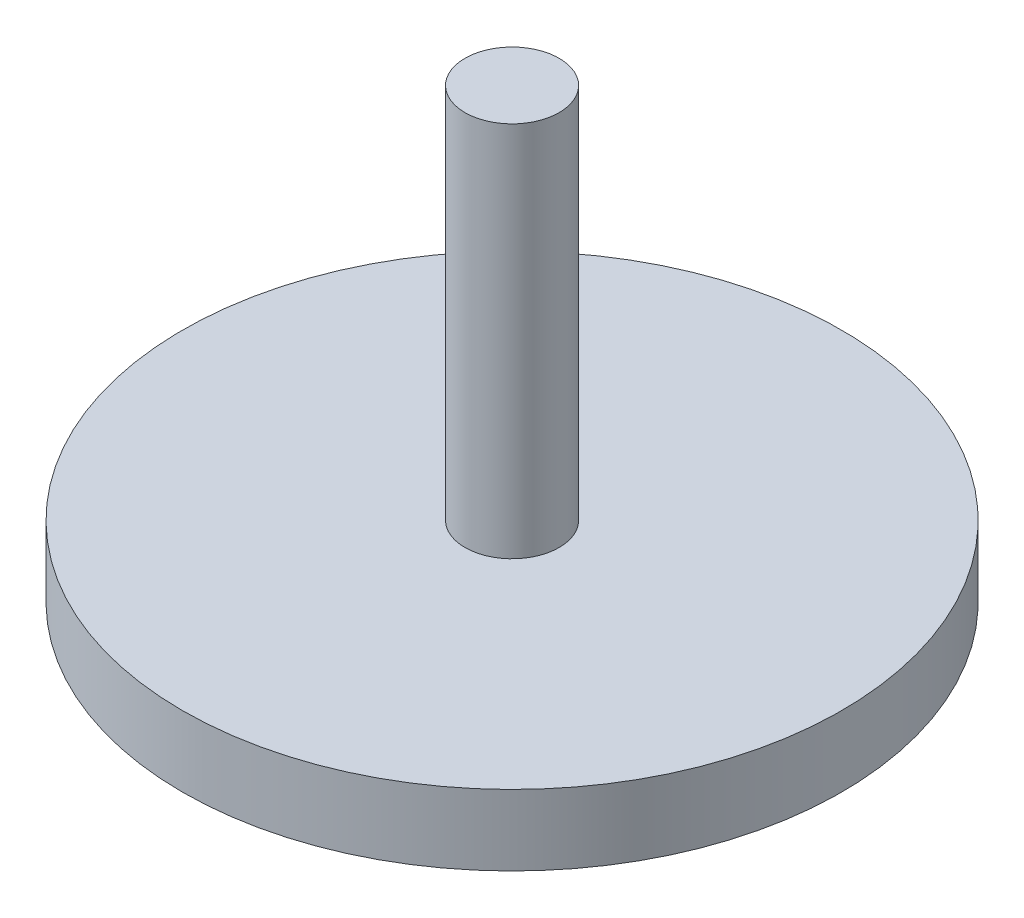
ISO-10303-21;
HEADER;
FILE_DESCRIPTION(('STEP AP214'),'2;1');
FILE_NAME('part.step','',(''),(''),'','','');
FILE_SCHEMA(('AUTOMOTIVE_DESIGN { 1 0 10303 214 1 1 1 1 }'));
ENDSEC;
DATA;
#1=APPLICATION_CONTEXT('core data for automotive mechanical design processes');
#2=APPLICATION_PROTOCOL_DEFINITION('international standard','automotive_design',2000,#1);
#3=PRODUCT_CONTEXT('',#1,'mechanical');
#4=PRODUCT('Part','Part','',(#3));
#5=PRODUCT_RELATED_PRODUCT_CATEGORY('part','',(#4));
#6=PRODUCT_DEFINITION_FORMATION('','',#4);
#7=PRODUCT_DEFINITION_CONTEXT('part definition',#1,'design');
#8=PRODUCT_DEFINITION('design','',#6,#7);
#9=PRODUCT_DEFINITION_SHAPE('','',#8);
#10=(LENGTH_UNIT() NAMED_UNIT(*) SI_UNIT(.MILLI.,.METRE.));
#11=(NAMED_UNIT(*) PLANE_ANGLE_UNIT() SI_UNIT($,.RADIAN.));
#12=(NAMED_UNIT(*) SI_UNIT($,.STERADIAN.) SOLID_ANGLE_UNIT());
#13=UNCERTAINTY_MEASURE_WITH_UNIT(LENGTH_MEASURE(1.E-05),#10,'distance_accuracy_value','');
#14=(GEOMETRIC_REPRESENTATION_CONTEXT(3) GLOBAL_UNCERTAINTY_ASSIGNED_CONTEXT((#13)) GLOBAL_UNIT_ASSIGNED_CONTEXT((#10,
#11,#12)) REPRESENTATION_CONTEXT('',''));
#15=CARTESIAN_POINT('',(0.,0.,0.));
#16=DIRECTION('',(0.,0.,1.));
#17=DIRECTION('',(1.,0.,0.));
#18=AXIS2_PLACEMENT_3D('',#15,#16,#17);
#19=CARTESIAN_POINT('',(0.,1.5,0.));
#20=DIRECTION('',(0.,-1.,0.));
#21=DIRECTION('',(0.,0.,-1.));
#22=AXIS2_PLACEMENT_3D('',#19,#20,#21);
#23=CYLINDRICAL_SURFACE('',#22,7.);
#24=CARTESIAN_POINT('',(0.,1.5,0.));
#25=DIRECTION('',(0.,1.,0.));
#26=DIRECTION('',(0.,0.,1.));
#27=AXIS2_PLACEMENT_3D('',#24,#25,#26);
#28=CIRCLE('',#27,7.);
#29=CARTESIAN_POINT('',(0.,1.5,7.));
#30=VERTEX_POINT('',#29);
#31=EDGE_CURVE('E10',#30,#30,#28,.T.);
#32=ORIENTED_EDGE('',*,*,#31,.F.);
#33=EDGE_LOOP('',(#32));
#34=FACE_BOUND('',#33,.T.);
#35=CARTESIAN_POINT('',(0.,0.,0.));
#36=DIRECTION('',(0.,1.,0.));
#37=DIRECTION('',(0.,0.,1.));
#38=AXIS2_PLACEMENT_3D('',#35,#36,#37);
#39=CIRCLE('',#38,7.);
#40=CARTESIAN_POINT('',(0.,0.,7.));
#41=VERTEX_POINT('',#40);
#42=EDGE_CURVE('E37',#41,#41,#39,.T.);
#43=ORIENTED_EDGE('',*,*,#42,.T.);
#44=EDGE_LOOP('',(#43));
#45=FACE_BOUND('',#44,.T.);
#46=ADVANCED_FACE('F34',(#34,#45),#23,.T.);
#47=CARTESIAN_POINT('',(0.,1.5,0.));
#48=DIRECTION('',(0.,1.,0.));
#49=DIRECTION('',(0.,0.,1.));
#50=AXIS2_PLACEMENT_3D('',#47,#48,#49);
#51=PLANE('',#50);
#52=CARTESIAN_POINT('',(0.,1.5,0.));
#53=DIRECTION('',(0.,1.,0.));
#54=DIRECTION('',(0.,0.,1.));
#55=AXIS2_PLACEMENT_3D('',#52,#53,#54);
#56=CIRCLE('',#55,1.);
#57=CARTESIAN_POINT('',(0.,1.5,1.));
#58=VERTEX_POINT('',#57);
#59=EDGE_CURVE('E46',#58,#58,#56,.T.);
#60=ORIENTED_EDGE('',*,*,#59,.F.);
#61=EDGE_LOOP('',(#60));
#62=FACE_BOUND('',#61,.T.);
#63=ORIENTED_EDGE('',*,*,#31,.T.);
#64=EDGE_LOOP('',(#63));
#65=FACE_BOUND('',#64,.T.);
#66=ADVANCED_FACE('F61',(#62,#65),#51,.T.);
#67=CARTESIAN_POINT('',(0.,0.,0.));
#68=DIRECTION('',(0.,1.,0.));
#69=DIRECTION('',(0.,0.,1.));
#70=AXIS2_PLACEMENT_3D('',#67,#68,#69);
#71=PLANE('',#70);
#72=ORIENTED_EDGE('',*,*,#42,.F.);
#73=EDGE_LOOP('',(#72));
#74=FACE_BOUND('',#73,.T.);
#75=ADVANCED_FACE('F57',(#74),#71,.F.);
#76=CARTESIAN_POINT('',(0.,9.5,0.));
#77=DIRECTION('',(0.,-1.,0.));
#78=DIRECTION('',(0.,0.,-1.));
#79=AXIS2_PLACEMENT_3D('',#76,#77,#78);
#80=CYLINDRICAL_SURFACE('',#79,1.);
#81=CARTESIAN_POINT('',(0.,9.5,0.));
#82=DIRECTION('',(0.,1.,0.));
#83=DIRECTION('',(0.,0.,1.));
#84=AXIS2_PLACEMENT_3D('',#81,#82,#83);
#85=CIRCLE('',#84,1.);
#86=CARTESIAN_POINT('',(0.,9.5,1.));
#87=VERTEX_POINT('',#86);
#88=EDGE_CURVE('E44',#87,#87,#85,.T.);
#89=ORIENTED_EDGE('',*,*,#88,.F.);
#90=EDGE_LOOP('',(#89));
#91=FACE_BOUND('',#90,.T.);
#92=ORIENTED_EDGE('',*,*,#59,.T.);
#93=EDGE_LOOP('',(#92));
#94=FACE_BOUND('',#93,.T.);
#95=ADVANCED_FACE('F54',(#91,#94),#80,.T.);
#96=CARTESIAN_POINT('',(0.,9.5,0.));
#97=DIRECTION('',(0.,1.,0.));
#98=DIRECTION('',(0.,0.,1.));
#99=AXIS2_PLACEMENT_3D('',#96,#97,#98);
#100=PLANE('',#99);
#101=ORIENTED_EDGE('',*,*,#88,.T.);
#102=EDGE_LOOP('',(#101));
#103=FACE_BOUND('',#102,.T.);
#104=ADVANCED_FACE('F52',(#103),#100,.T.);
#105=CLOSED_SHELL('',(#46,#66,#75,#95,#104));
#106=MANIFOLD_SOLID_BREP('B2',#105);
#107=ADVANCED_BREP_SHAPE_REPRESENTATION('',(#18,#106),#14);
#108=SHAPE_DEFINITION_REPRESENTATION(#9,#107);
ENDSEC;
END-ISO-10303-21;
